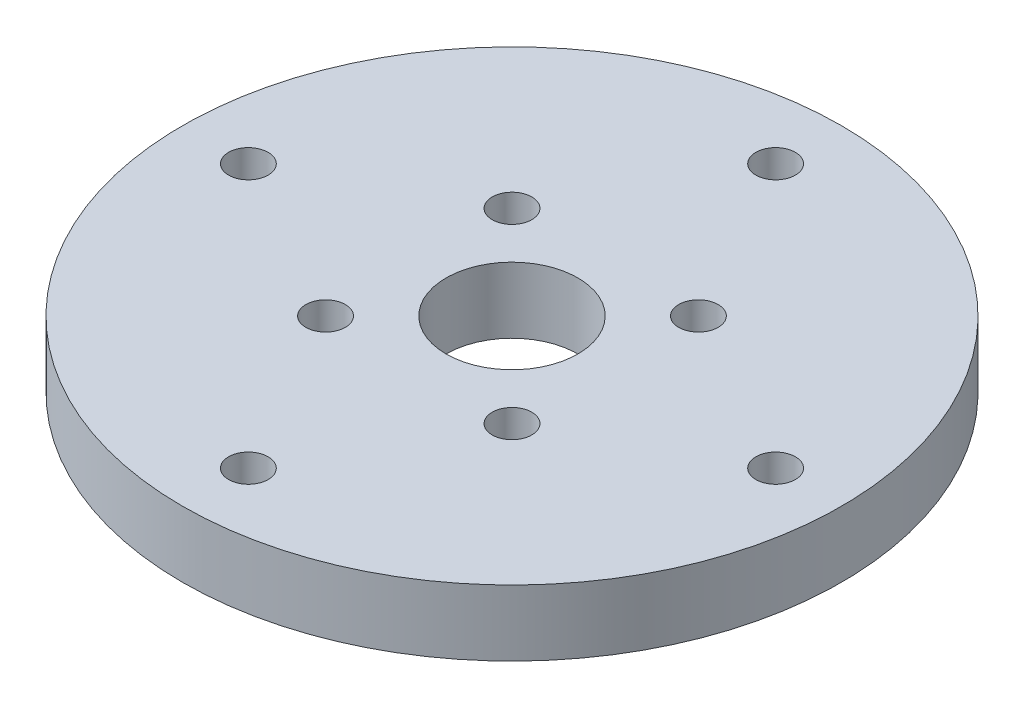
ISO-10303-21;
HEADER;
FILE_DESCRIPTION(('STEP AP214'),'2;1');
FILE_NAME('part.step','',(''),(''),'','','');
FILE_SCHEMA(('AUTOMOTIVE_DESIGN { 1 0 10303 214 1 1 1 1 }'));
ENDSEC;
DATA;
#1=APPLICATION_CONTEXT('core data for automotive mechanical design processes');
#2=APPLICATION_PROTOCOL_DEFINITION('international standard','automotive_design',2000,#1);
#3=PRODUCT_CONTEXT('',#1,'mechanical');
#4=PRODUCT('Part','Part','',(#3));
#5=PRODUCT_RELATED_PRODUCT_CATEGORY('part','',(#4));
#6=PRODUCT_DEFINITION_FORMATION('','',#4);
#7=PRODUCT_DEFINITION_CONTEXT('part definition',#1,'design');
#8=PRODUCT_DEFINITION('design','',#6,#7);
#9=PRODUCT_DEFINITION_SHAPE('','',#8);
#10=(LENGTH_UNIT() NAMED_UNIT(*) SI_UNIT(.MILLI.,.METRE.));
#11=(NAMED_UNIT(*) PLANE_ANGLE_UNIT() SI_UNIT($,.RADIAN.));
#12=(NAMED_UNIT(*) SI_UNIT($,.STERADIAN.) SOLID_ANGLE_UNIT());
#13=UNCERTAINTY_MEASURE_WITH_UNIT(LENGTH_MEASURE(1.E-05),#10,'distance_accuracy_value','');
#14=(GEOMETRIC_REPRESENTATION_CONTEXT(3) GLOBAL_UNCERTAINTY_ASSIGNED_CONTEXT((#13)) GLOBAL_UNIT_ASSIGNED_CONTEXT((#10,
#11,#12)) REPRESENTATION_CONTEXT('',''));
#15=CARTESIAN_POINT('',(0.,0.,0.));
#16=DIRECTION('',(0.,0.,1.));
#17=DIRECTION('',(1.,0.,0.));
#18=AXIS2_PLACEMENT_3D('',#15,#16,#17);
#19=CARTESIAN_POINT('',(0.,5.,0.));
#20=DIRECTION('',(0.,1.,0.));
#21=DIRECTION('',(0.,0.,1.));
#22=AXIS2_PLACEMENT_3D('',#19,#20,#21);
#23=PLANE('',#22);
#24=CARTESIAN_POINT('',(7.07106781186587,5.,7.07106781186508));
#25=DIRECTION('',(0.,1.,0.));
#26=DIRECTION('',(0.,0.,1.));
#27=AXIS2_PLACEMENT_3D('',#24,#25,#26);
#28=CIRCLE('',#27,1.50000000000056);
#29=CARTESIAN_POINT('',(7.07106781186587,5.,8.57106781186564));
#30=VERTEX_POINT('',#29);
#31=EDGE_CURVE('E104',#30,#30,#28,.T.);
#32=ORIENTED_EDGE('',*,*,#31,.F.);
#33=EDGE_LOOP('',(#32));
#34=FACE_BOUND('',#33,.T.);
#35=CARTESIAN_POINT('',(-19.9999999999993,5.,7.08093442161806E-13));
#36=DIRECTION('',(0.,1.,0.));
#37=DIRECTION('',(0.,0.,1.));
#38=AXIS2_PLACEMENT_3D('',#35,#36,#37);
#39=CIRCLE('',#38,1.5);
#40=CARTESIAN_POINT('',(-19.9999999999993,5.,1.50000000000071));
#41=VERTEX_POINT('',#40);
#42=EDGE_CURVE('E88',#41,#41,#39,.T.);
#43=ORIENTED_EDGE('',*,*,#42,.F.);
#44=EDGE_LOOP('',(#43));
#45=FACE_BOUND('',#44,.T.);
#46=CARTESIAN_POINT('',(20.0000000000007,5.,-7.05644148563511E-13));
#47=DIRECTION('',(0.,1.,0.));
#48=DIRECTION('',(0.,0.,1.));
#49=AXIS2_PLACEMENT_3D('',#46,#47,#48);
#50=CIRCLE('',#49,1.5);
#51=CARTESIAN_POINT('',(20.0000000000007,5.,1.4999999999993));
#52=VERTEX_POINT('',#51);
#53=EDGE_CURVE('E72',#52,#52,#50,.T.);
#54=ORIENTED_EDGE('',*,*,#53,.F.);
#55=EDGE_LOOP('',(#54));
#56=FACE_BOUND('',#55,.T.);
#57=CARTESIAN_POINT('',(0.,5.,0.));
#58=DIRECTION('',(0.,1.,0.));
#59=DIRECTION('',(0.,0.,1.));
#60=AXIS2_PLACEMENT_3D('',#57,#58,#59);
#61=CIRCLE('',#60,5.);
#62=CARTESIAN_POINT('',(0.,5.,5.));
#63=VERTEX_POINT('',#62);
#64=EDGE_CURVE('E56',#63,#63,#61,.T.);
#65=ORIENTED_EDGE('',*,*,#64,.F.);
#66=EDGE_LOOP('',(#65));
#67=FACE_BOUND('',#66,.T.);
#68=CARTESIAN_POINT('',(0.,5.,0.));
#69=DIRECTION('',(0.,1.,0.));
#70=DIRECTION('',(0.,0.,1.));
#71=AXIS2_PLACEMENT_3D('',#68,#69,#70);
#72=CIRCLE('',#71,25.);
#73=CARTESIAN_POINT('',(0.,5.,25.));
#74=VERTEX_POINT('',#73);
#75=EDGE_CURVE('E10',#74,#74,#72,.T.);
#76=ORIENTED_EDGE('',*,*,#75,.T.);
#77=EDGE_LOOP('',(#76));
#78=FACE_BOUND('',#77,.T.);
#79=CARTESIAN_POINT('',(-7.07106781186548,5.,-7.07106781186547));
#80=DIRECTION('',(0.,1.,0.));
#81=DIRECTION('',(0.,0.,1.));
#82=AXIS2_PLACEMENT_3D('',#79,#80,#81);
#83=CIRCLE('',#82,1.5);
#84=CARTESIAN_POINT('',(-7.07106781186548,5.,-5.57106781186547));
#85=VERTEX_POINT('',#84);
#86=EDGE_CURVE('E50',#85,#85,#83,.T.);
#87=ORIENTED_EDGE('',*,*,#86,.F.);
#88=EDGE_LOOP('',(#87));
#89=FACE_BOUND('',#88,.T.);
#90=CARTESIAN_POINT('',(0.,5.,-20.));
#91=DIRECTION('',(0.,1.,0.));
#92=DIRECTION('',(0.,0.,1.));
#93=AXIS2_PLACEMENT_3D('',#90,#91,#92);
#94=CIRCLE('',#93,1.5);
#95=CARTESIAN_POINT('',(0.,5.,-18.5));
#96=VERTEX_POINT('',#95);
#97=EDGE_CURVE('E64',#96,#96,#94,.T.);
#98=ORIENTED_EDGE('',*,*,#97,.F.);
#99=EDGE_LOOP('',(#98));
#100=FACE_BOUND('',#99,.T.);
#101=CARTESIAN_POINT('',(1.41128829712702E-12,5.,20.));
#102=DIRECTION('',(0.,1.,0.));
#103=DIRECTION('',(0.,0.,1.));
#104=AXIS2_PLACEMENT_3D('',#101,#102,#103);
#105=CIRCLE('',#104,1.5);
#106=CARTESIAN_POINT('',(1.41128829712702E-12,5.,21.5));
#107=VERTEX_POINT('',#106);
#108=EDGE_CURVE('E80',#107,#107,#105,.T.);
#109=ORIENTED_EDGE('',*,*,#108,.F.);
#110=EDGE_LOOP('',(#109));
#111=FACE_BOUND('',#110,.T.);
#112=CARTESIAN_POINT('',(7.0710678118655,5.,-7.07106781186545));
#113=DIRECTION('',(0.,1.,0.));
#114=DIRECTION('',(0.,0.,1.));
#115=AXIS2_PLACEMENT_3D('',#112,#113,#114);
#116=CIRCLE('',#115,1.5);
#117=CARTESIAN_POINT('',(7.0710678118655,5.,-5.57106781186545));
#118=VERTEX_POINT('',#117);
#119=EDGE_CURVE('E96',#118,#118,#116,.T.);
#120=ORIENTED_EDGE('',*,*,#119,.F.);
#121=EDGE_LOOP('',(#120));
#122=FACE_BOUND('',#121,.T.);
#123=CARTESIAN_POINT('',(-7.07106781186555,5.,7.0710678118654));
#124=DIRECTION('',(0.,1.,0.));
#125=DIRECTION('',(0.,0.,1.));
#126=AXIS2_PLACEMENT_3D('',#123,#124,#125);
#127=CIRCLE('',#126,1.5);
#128=CARTESIAN_POINT('',(-7.07106781186555,5.,8.5710678118654));
#129=VERTEX_POINT('',#128);
#130=EDGE_CURVE('E112',#129,#129,#127,.T.);
#131=ORIENTED_EDGE('',*,*,#130,.F.);
#132=EDGE_LOOP('',(#131));
#133=FACE_BOUND('',#132,.T.);
#134=ADVANCED_FACE('F37',(#34,#45,#56,#67,#78,#89,#100,#111,#122,#133),#23,.T.);
#135=CARTESIAN_POINT('',(0.,0.,0.));
#136=DIRECTION('',(0.,1.,0.));
#137=DIRECTION('',(0.,0.,1.));
#138=AXIS2_PLACEMENT_3D('',#135,#136,#137);
#139=PLANE('',#138);
#140=CARTESIAN_POINT('',(0.,0.,0.));
#141=DIRECTION('',(0.,1.,0.));
#142=DIRECTION('',(0.,0.,1.));
#143=AXIS2_PLACEMENT_3D('',#140,#141,#142);
#144=CIRCLE('',#143,25.);
#145=CARTESIAN_POINT('',(0.,0.,25.));
#146=VERTEX_POINT('',#145);
#147=EDGE_CURVE('E41',#146,#146,#144,.T.);
#148=ORIENTED_EDGE('',*,*,#147,.F.);
#149=EDGE_LOOP('',(#148));
#150=FACE_BOUND('',#149,.T.);
#151=CARTESIAN_POINT('',(-7.07106781186548,0.,-7.07106781186547));
#152=DIRECTION('',(0.,1.,0.));
#153=DIRECTION('',(0.,0.,1.));
#154=AXIS2_PLACEMENT_3D('',#151,#152,#153);
#155=CIRCLE('',#154,1.5);
#156=CARTESIAN_POINT('',(-7.07106781186548,0.,-5.57106781186547));
#157=VERTEX_POINT('',#156);
#158=EDGE_CURVE('E52',#157,#157,#155,.T.);
#159=ORIENTED_EDGE('',*,*,#158,.T.);
#160=EDGE_LOOP('',(#159));
#161=FACE_BOUND('',#160,.T.);
#162=CARTESIAN_POINT('',(0.,0.,0.));
#163=DIRECTION('',(0.,1.,0.));
#164=DIRECTION('',(0.,0.,1.));
#165=AXIS2_PLACEMENT_3D('',#162,#163,#164);
#166=CIRCLE('',#165,5.);
#167=CARTESIAN_POINT('',(0.,0.,5.));
#168=VERTEX_POINT('',#167);
#169=EDGE_CURVE('E60',#168,#168,#166,.T.);
#170=ORIENTED_EDGE('',*,*,#169,.T.);
#171=EDGE_LOOP('',(#170));
#172=FACE_BOUND('',#171,.T.);
#173=CARTESIAN_POINT('',(0.,0.,-20.));
#174=DIRECTION('',(0.,1.,0.));
#175=DIRECTION('',(0.,0.,1.));
#176=AXIS2_PLACEMENT_3D('',#173,#174,#175);
#177=CIRCLE('',#176,1.5);
#178=CARTESIAN_POINT('',(0.,0.,-18.5));
#179=VERTEX_POINT('',#178);
#180=EDGE_CURVE('E68',#179,#179,#177,.T.);
#181=ORIENTED_EDGE('',*,*,#180,.T.);
#182=EDGE_LOOP('',(#181));
#183=FACE_BOUND('',#182,.T.);
#184=CARTESIAN_POINT('',(20.0000000000007,0.,-7.05644148563511E-13));
#185=DIRECTION('',(0.,1.,0.));
#186=DIRECTION('',(0.,0.,1.));
#187=AXIS2_PLACEMENT_3D('',#184,#185,#186);
#188=CIRCLE('',#187,1.5);
#189=CARTESIAN_POINT('',(20.0000000000007,0.,1.4999999999993));
#190=VERTEX_POINT('',#189);
#191=EDGE_CURVE('E76',#190,#190,#188,.T.);
#192=ORIENTED_EDGE('',*,*,#191,.T.);
#193=EDGE_LOOP('',(#192));
#194=FACE_BOUND('',#193,.T.);
#195=CARTESIAN_POINT('',(1.41128829712702E-12,0.,20.));
#196=DIRECTION('',(0.,1.,0.));
#197=DIRECTION('',(0.,0.,1.));
#198=AXIS2_PLACEMENT_3D('',#195,#196,#197);
#199=CIRCLE('',#198,1.5);
#200=CARTESIAN_POINT('',(1.41128829712702E-12,0.,21.5));
#201=VERTEX_POINT('',#200);
#202=EDGE_CURVE('E84',#201,#201,#199,.T.);
#203=ORIENTED_EDGE('',*,*,#202,.T.);
#204=EDGE_LOOP('',(#203));
#205=FACE_BOUND('',#204,.T.);
#206=CARTESIAN_POINT('',(-19.9999999999993,0.,7.08093442161806E-13));
#207=DIRECTION('',(0.,1.,0.));
#208=DIRECTION('',(0.,0.,1.));
#209=AXIS2_PLACEMENT_3D('',#206,#207,#208);
#210=CIRCLE('',#209,1.5);
#211=CARTESIAN_POINT('',(-19.9999999999993,0.,1.50000000000071));
#212=VERTEX_POINT('',#211);
#213=EDGE_CURVE('E92',#212,#212,#210,.T.);
#214=ORIENTED_EDGE('',*,*,#213,.T.);
#215=EDGE_LOOP('',(#214));
#216=FACE_BOUND('',#215,.T.);
#217=CARTESIAN_POINT('',(7.0710678118655,0.,-7.07106781186545));
#218=DIRECTION('',(0.,1.,0.));
#219=DIRECTION('',(0.,0.,1.));
#220=AXIS2_PLACEMENT_3D('',#217,#218,#219);
#221=CIRCLE('',#220,1.5);
#222=CARTESIAN_POINT('',(7.0710678118655,0.,-5.57106781186545));
#223=VERTEX_POINT('',#222);
#224=EDGE_CURVE('E100',#223,#223,#221,.T.);
#225=ORIENTED_EDGE('',*,*,#224,.T.);
#226=EDGE_LOOP('',(#225));
#227=FACE_BOUND('',#226,.T.);
#228=CARTESIAN_POINT('',(7.07106781186587,0.,7.07106781186508));
#229=DIRECTION('',(0.,1.,0.));
#230=DIRECTION('',(0.,0.,1.));
#231=AXIS2_PLACEMENT_3D('',#228,#229,#230);
#232=CIRCLE('',#231,1.50000000000056);
#233=CARTESIAN_POINT('',(7.07106781186587,0.,8.57106781186564));
#234=VERTEX_POINT('',#233);
#235=EDGE_CURVE('E108',#234,#234,#232,.T.);
#236=ORIENTED_EDGE('',*,*,#235,.T.);
#237=EDGE_LOOP('',(#236));
#238=FACE_BOUND('',#237,.T.);
#239=CARTESIAN_POINT('',(-7.07106781186555,0.,7.0710678118654));
#240=DIRECTION('',(0.,1.,0.));
#241=DIRECTION('',(0.,0.,1.));
#242=AXIS2_PLACEMENT_3D('',#239,#240,#241);
#243=CIRCLE('',#242,1.5);
#244=CARTESIAN_POINT('',(-7.07106781186555,0.,8.5710678118654));
#245=VERTEX_POINT('',#244);
#246=EDGE_CURVE('E116',#245,#245,#243,.T.);
#247=ORIENTED_EDGE('',*,*,#246,.T.);
#248=EDGE_LOOP('',(#247));
#249=FACE_BOUND('',#248,.T.);
#250=ADVANCED_FACE('F128',(#150,#161,#172,#183,#194,#205,#216,#227,#238,#249),#139,.F.);
#251=CARTESIAN_POINT('',(0.,5.,0.));
#252=DIRECTION('',(0.,-1.,0.));
#253=DIRECTION('',(0.,0.,-1.));
#254=AXIS2_PLACEMENT_3D('',#251,#252,#253);
#255=CYLINDRICAL_SURFACE('',#254,25.);
#256=ORIENTED_EDGE('',*,*,#75,.F.);
#257=EDGE_LOOP('',(#256));
#258=FACE_BOUND('',#257,.T.);
#259=ORIENTED_EDGE('',*,*,#147,.T.);
#260=EDGE_LOOP('',(#259));
#261=FACE_BOUND('',#260,.T.);
#262=ADVANCED_FACE('F39',(#258,#261),#255,.T.);
#263=CARTESIAN_POINT('',(-7.07106781186548,5.,-7.07106781186547));
#264=DIRECTION('',(0.,-1.,0.));
#265=DIRECTION('',(0.,0.,-1.));
#266=AXIS2_PLACEMENT_3D('',#263,#264,#265);
#267=CYLINDRICAL_SURFACE('',#266,1.5);
#268=ORIENTED_EDGE('',*,*,#86,.T.);
#269=EDGE_LOOP('',(#268));
#270=FACE_BOUND('',#269,.T.);
#271=ORIENTED_EDGE('',*,*,#158,.F.);
#272=EDGE_LOOP('',(#271));
#273=FACE_BOUND('',#272,.T.);
#274=ADVANCED_FACE('F138',(#270,#273),#267,.F.);
#275=CARTESIAN_POINT('',(0.,5.,0.));
#276=DIRECTION('',(0.,-1.,0.));
#277=DIRECTION('',(0.,0.,-1.));
#278=AXIS2_PLACEMENT_3D('',#275,#276,#277);
#279=CYLINDRICAL_SURFACE('',#278,5.);
#280=ORIENTED_EDGE('',*,*,#64,.T.);
#281=EDGE_LOOP('',(#280));
#282=FACE_BOUND('',#281,.T.);
#283=ORIENTED_EDGE('',*,*,#169,.F.);
#284=EDGE_LOOP('',(#283));
#285=FACE_BOUND('',#284,.T.);
#286=ADVANCED_FACE('F141',(#282,#285),#279,.F.);
#287=CARTESIAN_POINT('',(0.,5.,-20.));
#288=DIRECTION('',(0.,-1.,0.));
#289=DIRECTION('',(0.,0.,-1.));
#290=AXIS2_PLACEMENT_3D('',#287,#288,#289);
#291=CYLINDRICAL_SURFACE('',#290,1.5);
#292=ORIENTED_EDGE('',*,*,#97,.T.);
#293=EDGE_LOOP('',(#292));
#294=FACE_BOUND('',#293,.T.);
#295=ORIENTED_EDGE('',*,*,#180,.F.);
#296=EDGE_LOOP('',(#295));
#297=FACE_BOUND('',#296,.T.);
#298=ADVANCED_FACE('F145',(#294,#297),#291,.F.);
#299=CARTESIAN_POINT('',(20.0000000000007,5.,-7.05644148563511E-13));
#300=DIRECTION('',(0.,-1.,0.));
#301=DIRECTION('',(0.,0.,-1.));
#302=AXIS2_PLACEMENT_3D('',#299,#300,#301);
#303=CYLINDRICAL_SURFACE('',#302,1.5);
#304=ORIENTED_EDGE('',*,*,#53,.T.);
#305=EDGE_LOOP('',(#304));
#306=FACE_BOUND('',#305,.T.);
#307=ORIENTED_EDGE('',*,*,#191,.F.);
#308=EDGE_LOOP('',(#307));
#309=FACE_BOUND('',#308,.T.);
#310=ADVANCED_FACE('F149',(#306,#309),#303,.F.);
#311=CARTESIAN_POINT('',(1.41128829712702E-12,5.,20.));
#312=DIRECTION('',(0.,-1.,0.));
#313=DIRECTION('',(0.,0.,-1.));
#314=AXIS2_PLACEMENT_3D('',#311,#312,#313);
#315=CYLINDRICAL_SURFACE('',#314,1.5);
#316=ORIENTED_EDGE('',*,*,#108,.T.);
#317=EDGE_LOOP('',(#316));
#318=FACE_BOUND('',#317,.T.);
#319=ORIENTED_EDGE('',*,*,#202,.F.);
#320=EDGE_LOOP('',(#319));
#321=FACE_BOUND('',#320,.T.);
#322=ADVANCED_FACE('F153',(#318,#321),#315,.F.);
#323=CARTESIAN_POINT('',(-19.9999999999993,5.,7.08093442161806E-13));
#324=DIRECTION('',(0.,-1.,0.));
#325=DIRECTION('',(0.,0.,-1.));
#326=AXIS2_PLACEMENT_3D('',#323,#324,#325);
#327=CYLINDRICAL_SURFACE('',#326,1.5);
#328=ORIENTED_EDGE('',*,*,#42,.T.);
#329=EDGE_LOOP('',(#328));
#330=FACE_BOUND('',#329,.T.);
#331=ORIENTED_EDGE('',*,*,#213,.F.);
#332=EDGE_LOOP('',(#331));
#333=FACE_BOUND('',#332,.T.);
#334=ADVANCED_FACE('F157',(#330,#333),#327,.F.);
#335=CARTESIAN_POINT('',(7.0710678118655,5.,-7.07106781186545));
#336=DIRECTION('',(0.,-1.,0.));
#337=DIRECTION('',(0.,0.,-1.));
#338=AXIS2_PLACEMENT_3D('',#335,#336,#337);
#339=CYLINDRICAL_SURFACE('',#338,1.5);
#340=ORIENTED_EDGE('',*,*,#119,.T.);
#341=EDGE_LOOP('',(#340));
#342=FACE_BOUND('',#341,.T.);
#343=ORIENTED_EDGE('',*,*,#224,.F.);
#344=EDGE_LOOP('',(#343));
#345=FACE_BOUND('',#344,.T.);
#346=ADVANCED_FACE('F161',(#342,#345),#339,.F.);
#347=CARTESIAN_POINT('',(7.07106781186587,5.,7.07106781186508));
#348=DIRECTION('',(0.,-1.,0.));
#349=DIRECTION('',(0.,0.,-1.));
#350=AXIS2_PLACEMENT_3D('',#347,#348,#349);
#351=CYLINDRICAL_SURFACE('',#350,1.50000000000056);
#352=ORIENTED_EDGE('',*,*,#31,.T.);
#353=EDGE_LOOP('',(#352));
#354=FACE_BOUND('',#353,.T.);
#355=ORIENTED_EDGE('',*,*,#235,.F.);
#356=EDGE_LOOP('',(#355));
#357=FACE_BOUND('',#356,.T.);
#358=ADVANCED_FACE('F165',(#354,#357),#351,.F.);
#359=CARTESIAN_POINT('',(-7.07106781186555,5.,7.0710678118654));
#360=DIRECTION('',(0.,-1.,0.));
#361=DIRECTION('',(0.,0.,-1.));
#362=AXIS2_PLACEMENT_3D('',#359,#360,#361);
#363=CYLINDRICAL_SURFACE('',#362,1.5);
#364=ORIENTED_EDGE('',*,*,#130,.T.);
#365=EDGE_LOOP('',(#364));
#366=FACE_BOUND('',#365,.T.);
#367=ORIENTED_EDGE('',*,*,#246,.F.);
#368=EDGE_LOOP('',(#367));
#369=FACE_BOUND('',#368,.T.);
#370=ADVANCED_FACE('F124',(#366,#369),#363,.F.);
#371=CLOSED_SHELL('',(#134,#250,#262,#274,#286,#298,#310,#322,#334,#346,#358,#370));
#372=MANIFOLD_SOLID_BREP('B2',#371);
#373=ADVANCED_BREP_SHAPE_REPRESENTATION('',(#18,#372),#14);
#374=SHAPE_DEFINITION_REPRESENTATION(#9,#373);
ENDSEC;
END-ISO-10303-21;
